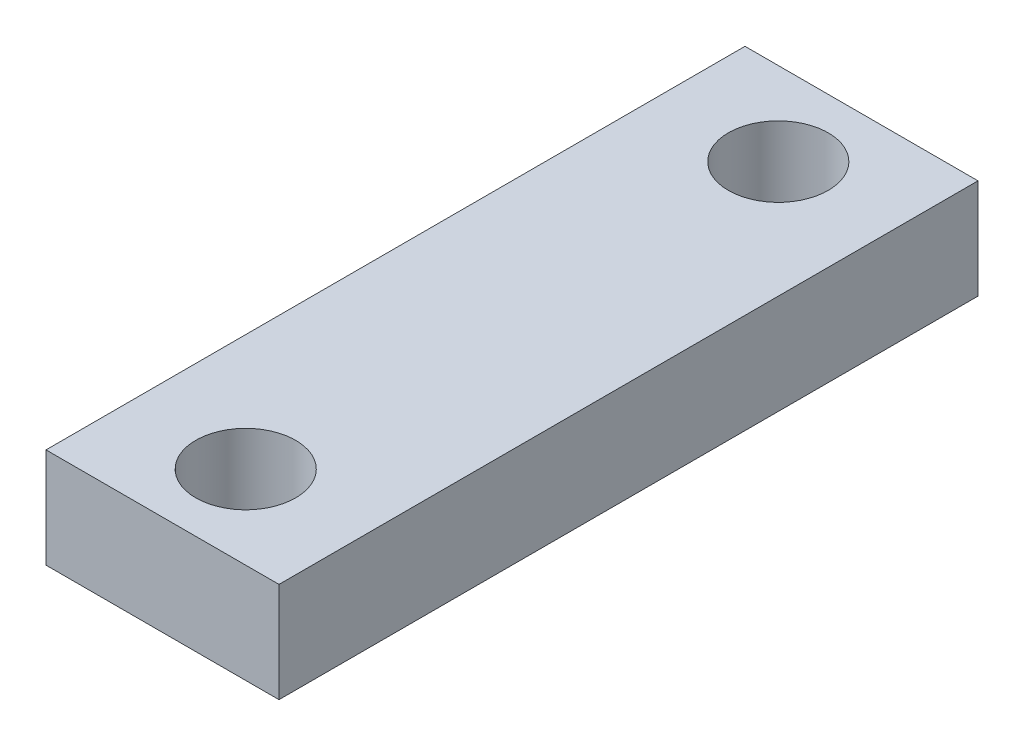
ISO-10303-21;
HEADER;
FILE_DESCRIPTION(('STEP AP214'),'2;1');
FILE_NAME('part.step','',(''),(''),'','','');
FILE_SCHEMA(('AUTOMOTIVE_DESIGN { 1 0 10303 214 1 1 1 1 }'));
ENDSEC;
DATA;
#1=APPLICATION_CONTEXT('core data for automotive mechanical design processes');
#2=APPLICATION_PROTOCOL_DEFINITION('international standard','automotive_design',2000,#1);
#3=PRODUCT_CONTEXT('',#1,'mechanical');
#4=PRODUCT('Part','Part','',(#3));
#5=PRODUCT_RELATED_PRODUCT_CATEGORY('part','',(#4));
#6=PRODUCT_DEFINITION_FORMATION('','',#4);
#7=PRODUCT_DEFINITION_CONTEXT('part definition',#1,'design');
#8=PRODUCT_DEFINITION('design','',#6,#7);
#9=PRODUCT_DEFINITION_SHAPE('','',#8);
#10=(LENGTH_UNIT() NAMED_UNIT(*) SI_UNIT(.MILLI.,.METRE.));
#11=(NAMED_UNIT(*) PLANE_ANGLE_UNIT() SI_UNIT($,.RADIAN.));
#12=(NAMED_UNIT(*) SI_UNIT($,.STERADIAN.) SOLID_ANGLE_UNIT());
#13=UNCERTAINTY_MEASURE_WITH_UNIT(LENGTH_MEASURE(1.E-05),#10,'distance_accuracy_value','');
#14=(GEOMETRIC_REPRESENTATION_CONTEXT(3) GLOBAL_UNCERTAINTY_ASSIGNED_CONTEXT((#13)) GLOBAL_UNIT_ASSIGNED_CONTEXT((#10,
#11,#12)) REPRESENTATION_CONTEXT('',''));
#15=CARTESIAN_POINT('',(0.,0.,0.));
#16=DIRECTION('',(0.,0.,1.));
#17=DIRECTION('',(1.,0.,0.));
#18=AXIS2_PLACEMENT_3D('',#15,#16,#17);
#19=CARTESIAN_POINT('',(0.,6.,0.));
#20=DIRECTION('',(0.,1.,0.));
#21=DIRECTION('',(0.,0.,1.));
#22=AXIS2_PLACEMENT_3D('',#19,#20,#21);
#23=PLANE('',#22);
#24=CARTESIAN_POINT('',(0.,6.,-16.));
#25=DIRECTION('',(0.,1.,0.));
#26=DIRECTION('',(0.,0.,1.));
#27=AXIS2_PLACEMENT_3D('',#24,#25,#26);
#28=CIRCLE('',#27,3.00000000000005);
#29=CARTESIAN_POINT('',(0.,6.,-13.));
#30=VERTEX_POINT('',#29);
#31=EDGE_CURVE('E107',#30,#30,#28,.T.);
#32=ORIENTED_EDGE('',*,*,#31,.F.);
#33=EDGE_LOOP('',(#32));
#34=FACE_BOUND('',#33,.T.);
#35=DIRECTION('',(1.,0.,0.));
#36=VECTOR('',#35,1.);
#37=CARTESIAN_POINT('',(-7.00000000000001,6.,20.9999999999999));
#38=LINE('',#37,#36);
#39=CARTESIAN_POINT('',(-7.00000000000001,6.,20.9999999999999));
#40=VERTEX_POINT('',#39);
#41=CARTESIAN_POINT('',(7.00000000000001,6.,20.9999999999999));
#42=VERTEX_POINT('',#41);
#43=EDGE_CURVE('E91',#40,#42,#38,.T.);
#44=ORIENTED_EDGE('',*,*,#43,.T.);
#45=DIRECTION('',(0.,0.,-1.));
#46=VECTOR('',#45,1.);
#47=CARTESIAN_POINT('',(7.00000000000001,6.,20.9999999999999));
#48=LINE('',#47,#46);
#49=CARTESIAN_POINT('',(7.00000000000001,6.,-20.9999999999999));
#50=VERTEX_POINT('',#49);
#51=EDGE_CURVE('E86',#42,#50,#48,.T.);
#52=ORIENTED_EDGE('',*,*,#51,.T.);
#53=DIRECTION('',(-1.,0.,0.));
#54=VECTOR('',#53,1.);
#55=CARTESIAN_POINT('',(7.00000000000001,6.,-20.9999999999999));
#56=LINE('',#55,#54);
#57=CARTESIAN_POINT('',(-7.00000000000001,6.,-20.9999999999999));
#58=VERTEX_POINT('',#57);
#59=EDGE_CURVE('E87',#50,#58,#56,.T.);
#60=ORIENTED_EDGE('',*,*,#59,.T.);
#61=DIRECTION('',(0.,0.,1.));
#62=VECTOR('',#61,1.);
#63=CARTESIAN_POINT('',(-7.00000000000001,6.,-20.9999999999999));
#64=LINE('',#63,#62);
#65=EDGE_CURVE('E57',#58,#40,#64,.T.);
#66=ORIENTED_EDGE('',*,*,#65,.T.);
#67=EDGE_LOOP('',(#44,#52,#60,#66));
#68=FACE_BOUND('',#67,.T.);
#69=CARTESIAN_POINT('',(0.,6.,16.));
#70=DIRECTION('',(0.,1.,0.));
#71=DIRECTION('',(0.,0.,1.));
#72=AXIS2_PLACEMENT_3D('',#69,#70,#71);
#73=CIRCLE('',#72,3.00000000000005);
#74=CARTESIAN_POINT('',(0.,6.,19.0000000000001));
#75=VERTEX_POINT('',#74);
#76=EDGE_CURVE('E123',#75,#75,#73,.T.);
#77=ORIENTED_EDGE('',*,*,#76,.F.);
#78=EDGE_LOOP('',(#77));
#79=FACE_BOUND('',#78,.T.);
#80=ADVANCED_FACE('F39',(#34,#68,#79),#23,.T.);
#81=CARTESIAN_POINT('',(0.,0.,0.));
#82=DIRECTION('',(0.,1.,0.));
#83=DIRECTION('',(0.,0.,1.));
#84=AXIS2_PLACEMENT_3D('',#81,#82,#83);
#85=PLANE('',#84);
#86=DIRECTION('',(1.,0.,0.));
#87=VECTOR('',#86,1.);
#88=CARTESIAN_POINT('',(-7.00000000000001,0.,20.9999999999999));
#89=LINE('',#88,#87);
#90=CARTESIAN_POINT('',(-7.00000000000001,0.,20.9999999999999));
#91=VERTEX_POINT('',#90);
#92=CARTESIAN_POINT('',(7.00000000000001,0.,20.9999999999999));
#93=VERTEX_POINT('',#92);
#94=EDGE_CURVE('E104',#91,#93,#89,.T.);
#95=ORIENTED_EDGE('',*,*,#94,.F.);
#96=DIRECTION('',(0.,0.,1.));
#97=VECTOR('',#96,1.);
#98=CARTESIAN_POINT('',(-7.00000000000001,0.,-20.9999999999999));
#99=LINE('',#98,#97);
#100=CARTESIAN_POINT('',(-7.00000000000001,0.,-20.9999999999999));
#101=VERTEX_POINT('',#100);
#102=EDGE_CURVE('E80',#101,#91,#99,.T.);
#103=ORIENTED_EDGE('',*,*,#102,.F.);
#104=DIRECTION('',(-1.,0.,0.));
#105=VECTOR('',#104,1.);
#106=CARTESIAN_POINT('',(7.00000000000001,0.,-20.9999999999999));
#107=LINE('',#106,#105);
#108=CARTESIAN_POINT('',(7.00000000000001,0.,-20.9999999999999));
#109=VERTEX_POINT('',#108);
#110=EDGE_CURVE('E75',#109,#101,#107,.T.);
#111=ORIENTED_EDGE('',*,*,#110,.F.);
#112=DIRECTION('',(0.,0.,-1.));
#113=VECTOR('',#112,1.);
#114=CARTESIAN_POINT('',(7.00000000000001,0.,20.9999999999999));
#115=LINE('',#114,#113);
#116=EDGE_CURVE('E94',#93,#109,#115,.T.);
#117=ORIENTED_EDGE('',*,*,#116,.F.);
#118=EDGE_LOOP('',(#95,#103,#111,#117));
#119=FACE_BOUND('',#118,.T.);
#120=CARTESIAN_POINT('',(0.,0.,-16.));
#121=DIRECTION('',(0.,1.,0.));
#122=DIRECTION('',(0.,0.,1.));
#123=AXIS2_PLACEMENT_3D('',#120,#121,#122);
#124=CIRCLE('',#123,3.00000000000005);
#125=CARTESIAN_POINT('',(0.,0.,-13.));
#126=VERTEX_POINT('',#125);
#127=EDGE_CURVE('E120',#126,#126,#124,.T.);
#128=ORIENTED_EDGE('',*,*,#127,.T.);
#129=EDGE_LOOP('',(#128));
#130=FACE_BOUND('',#129,.T.);
#131=CARTESIAN_POINT('',(0.,0.,16.));
#132=DIRECTION('',(0.,1.,0.));
#133=DIRECTION('',(0.,0.,1.));
#134=AXIS2_PLACEMENT_3D('',#131,#132,#133);
#135=CIRCLE('',#134,3.00000000000005);
#136=CARTESIAN_POINT('',(0.,0.,19.0000000000001));
#137=VERTEX_POINT('',#136);
#138=EDGE_CURVE('E125',#137,#137,#135,.T.);
#139=ORIENTED_EDGE('',*,*,#138,.T.);
#140=EDGE_LOOP('',(#139));
#141=FACE_BOUND('',#140,.T.);
#142=ADVANCED_FACE('F114',(#119,#130,#141),#85,.F.);
#143=CARTESIAN_POINT('',(-7.00000000000001,6.,20.9999999999999));
#144=DIRECTION('',(0.,0.,-1.));
#145=DIRECTION('',(-1.,0.,0.));
#146=AXIS2_PLACEMENT_3D('',#143,#144,#145);
#147=PLANE('',#146);
#148=ORIENTED_EDGE('',*,*,#94,.T.);
#149=DIRECTION('',(0.,-1.,0.));
#150=VECTOR('',#149,1.);
#151=CARTESIAN_POINT('',(7.00000000000001,6.,20.9999999999999));
#152=LINE('',#151,#150);
#153=EDGE_CURVE('E11',#42,#93,#152,.T.);
#154=ORIENTED_EDGE('',*,*,#153,.F.);
#155=ORIENTED_EDGE('',*,*,#43,.F.);
#156=DIRECTION('',(0.,-1.,0.));
#157=VECTOR('',#156,1.);
#158=CARTESIAN_POINT('',(-7.00000000000001,6.,20.9999999999999));
#159=LINE('',#158,#157);
#160=EDGE_CURVE('E98',#40,#91,#159,.T.);
#161=ORIENTED_EDGE('',*,*,#160,.T.);
#162=EDGE_LOOP('',(#148,#154,#155,#161));
#163=FACE_BOUND('',#162,.T.);
#164=ADVANCED_FACE('F41',(#163),#147,.F.);
#165=CARTESIAN_POINT('',(7.00000000000001,6.,20.9999999999999));
#166=DIRECTION('',(-1.,0.,0.));
#167=DIRECTION('',(0.,0.,1.));
#168=AXIS2_PLACEMENT_3D('',#165,#166,#167);
#169=PLANE('',#168);
#170=ORIENTED_EDGE('',*,*,#116,.T.);
#171=DIRECTION('',(0.,-1.,0.));
#172=VECTOR('',#171,1.);
#173=CARTESIAN_POINT('',(7.00000000000001,6.,-20.9999999999999));
#174=LINE('',#173,#172);
#175=EDGE_CURVE('E48',#50,#109,#174,.T.);
#176=ORIENTED_EDGE('',*,*,#175,.F.);
#177=ORIENTED_EDGE('',*,*,#51,.F.);
#178=ORIENTED_EDGE('',*,*,#153,.T.);
#179=EDGE_LOOP('',(#170,#176,#177,#178));
#180=FACE_BOUND('',#179,.T.);
#181=ADVANCED_FACE('F92',(#180),#169,.F.);
#182=CARTESIAN_POINT('',(7.00000000000001,6.,-20.9999999999999));
#183=DIRECTION('',(0.,0.,1.));
#184=DIRECTION('',(1.,0.,0.));
#185=AXIS2_PLACEMENT_3D('',#182,#183,#184);
#186=PLANE('',#185);
#187=ORIENTED_EDGE('',*,*,#110,.T.);
#188=DIRECTION('',(0.,-1.,0.));
#189=VECTOR('',#188,1.);
#190=CARTESIAN_POINT('',(-7.00000000000001,6.,-20.9999999999999));
#191=LINE('',#190,#189);
#192=EDGE_CURVE('E96',#58,#101,#191,.T.);
#193=ORIENTED_EDGE('',*,*,#192,.F.);
#194=ORIENTED_EDGE('',*,*,#59,.F.);
#195=ORIENTED_EDGE('',*,*,#175,.T.);
#196=EDGE_LOOP('',(#187,#193,#194,#195));
#197=FACE_BOUND('',#196,.T.);
#198=ADVANCED_FACE('F100',(#197),#186,.F.);
#199=CARTESIAN_POINT('',(-7.00000000000001,6.,-20.9999999999999));
#200=DIRECTION('',(1.,0.,0.));
#201=DIRECTION('',(0.,0.,-1.));
#202=AXIS2_PLACEMENT_3D('',#199,#200,#201);
#203=PLANE('',#202);
#204=ORIENTED_EDGE('',*,*,#102,.T.);
#205=ORIENTED_EDGE('',*,*,#160,.F.);
#206=ORIENTED_EDGE('',*,*,#65,.F.);
#207=ORIENTED_EDGE('',*,*,#192,.T.);
#208=EDGE_LOOP('',(#204,#205,#206,#207));
#209=FACE_BOUND('',#208,.T.);
#210=ADVANCED_FACE('F112',(#209),#203,.F.);
#211=CARTESIAN_POINT('',(0.,6.,-16.));
#212=DIRECTION('',(0.,-1.,0.));
#213=DIRECTION('',(0.,0.,-1.));
#214=AXIS2_PLACEMENT_3D('',#211,#212,#213);
#215=CYLINDRICAL_SURFACE('',#214,3.00000000000005);
#216=ORIENTED_EDGE('',*,*,#31,.T.);
#217=EDGE_LOOP('',(#216));
#218=FACE_BOUND('',#217,.T.);
#219=ORIENTED_EDGE('',*,*,#127,.F.);
#220=EDGE_LOOP('',(#219));
#221=FACE_BOUND('',#220,.T.);
#222=ADVANCED_FACE('F141',(#218,#221),#215,.F.);
#223=CARTESIAN_POINT('',(0.,6.,16.));
#224=DIRECTION('',(0.,-1.,0.));
#225=DIRECTION('',(0.,0.,-1.));
#226=AXIS2_PLACEMENT_3D('',#223,#224,#225);
#227=CYLINDRICAL_SURFACE('',#226,3.00000000000005);
#228=ORIENTED_EDGE('',*,*,#76,.T.);
#229=EDGE_LOOP('',(#228));
#230=FACE_BOUND('',#229,.T.);
#231=ORIENTED_EDGE('',*,*,#138,.F.);
#232=EDGE_LOOP('',(#231));
#233=FACE_BOUND('',#232,.T.);
#234=ADVANCED_FACE('F127',(#230,#233),#227,.F.);
#235=CLOSED_SHELL('',(#80,#142,#164,#181,#198,#210,#222,#234));
#236=MANIFOLD_SOLID_BREP('B2',#235);
#237=ADVANCED_BREP_SHAPE_REPRESENTATION('',(#18,#236),#14);
#238=SHAPE_DEFINITION_REPRESENTATION(#9,#237);
ENDSEC;
END-ISO-10303-21;
